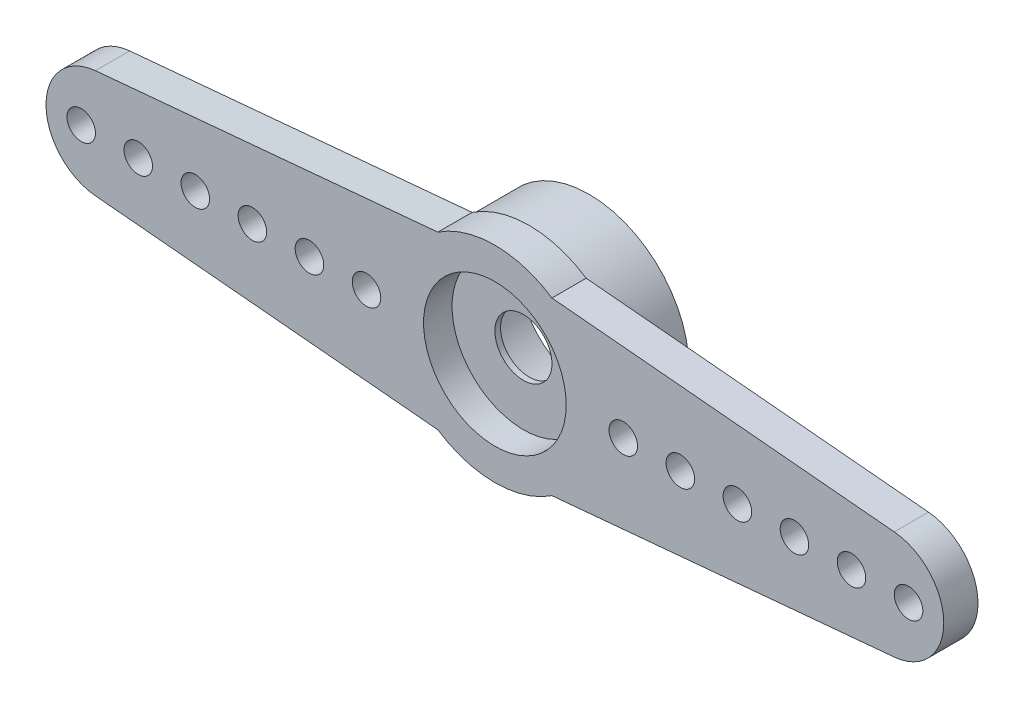
ISO-10303-21;
HEADER;
FILE_DESCRIPTION(('STEP AP214'),'2;1');
FILE_NAME('part.step','',(''),(''),'','','');
FILE_SCHEMA(('AUTOMOTIVE_DESIGN { 1 0 10303 214 1 1 1 1 }'));
ENDSEC;
DATA;
#1=APPLICATION_CONTEXT('core data for automotive mechanical design processes');
#2=APPLICATION_PROTOCOL_DEFINITION('international standard','automotive_design',2000,#1);
#3=PRODUCT_CONTEXT('',#1,'mechanical');
#4=PRODUCT('Part','Part','',(#3));
#5=PRODUCT_RELATED_PRODUCT_CATEGORY('part','',(#4));
#6=PRODUCT_DEFINITION_FORMATION('','',#4);
#7=PRODUCT_DEFINITION_CONTEXT('part definition',#1,'design');
#8=PRODUCT_DEFINITION('design','',#6,#7);
#9=PRODUCT_DEFINITION_SHAPE('','',#8);
#10=(LENGTH_UNIT() NAMED_UNIT(*) SI_UNIT(.MILLI.,.METRE.));
#11=(NAMED_UNIT(*) PLANE_ANGLE_UNIT() SI_UNIT($,.RADIAN.));
#12=(NAMED_UNIT(*) SI_UNIT($,.STERADIAN.) SOLID_ANGLE_UNIT());
#13=UNCERTAINTY_MEASURE_WITH_UNIT(LENGTH_MEASURE(1.E-05),#10,'distance_accuracy_value','');
#14=(GEOMETRIC_REPRESENTATION_CONTEXT(3) GLOBAL_UNCERTAINTY_ASSIGNED_CONTEXT((#13)) GLOBAL_UNIT_ASSIGNED_CONTEXT((#10,
#11,#12)) REPRESENTATION_CONTEXT('',''));
#15=CARTESIAN_POINT('',(0.,0.,0.));
#16=DIRECTION('',(0.,0.,1.));
#17=DIRECTION('',(1.,0.,0.));
#18=AXIS2_PLACEMENT_3D('',#15,#16,#17);
#19=CARTESIAN_POINT('',(0.,0.,-2.1));
#20=DIRECTION('',(0.,0.,1.));
#21=DIRECTION('',(1.,0.,0.));
#22=AXIS2_PLACEMENT_3D('',#19,#20,#21);
#23=CYLINDRICAL_SURFACE('',#22,1.);
#24=CARTESIAN_POINT('',(0.,0.,0.2));
#25=DIRECTION('',(0.,0.,1.));
#26=DIRECTION('',(1.,0.,0.));
#27=AXIS2_PLACEMENT_3D('',#24,#25,#26);
#28=CIRCLE('',#27,1.);
#29=CARTESIAN_POINT('',(1.,0.,0.2));
#30=VERTEX_POINT('',#29);
#31=EDGE_CURVE('E166',#30,#30,#28,.T.);
#32=ORIENTED_EDGE('',*,*,#31,.T.);
#33=EDGE_LOOP('',(#32));
#34=FACE_BOUND('',#33,.T.);
#35=CARTESIAN_POINT('',(0.,0.,0.));
#36=DIRECTION('',(0.,0.,-1.));
#37=DIRECTION('',(-1.,0.,0.));
#38=AXIS2_PLACEMENT_3D('',#35,#36,#37);
#39=CIRCLE('',#38,1.);
#40=CARTESIAN_POINT('',(-1.,0.,0.));
#41=VERTEX_POINT('',#40);
#42=EDGE_CURVE('E163',#41,#41,#39,.F.);
#43=ORIENTED_EDGE('',*,*,#42,.F.);
#44=EDGE_LOOP('',(#43));
#45=FACE_BOUND('',#44,.T.);
#46=ADVANCED_FACE('F37',(#34,#45),#23,.F.);
#47=CARTESIAN_POINT('',(-14.,1.9,1.2));
#48=DIRECTION('',(0.0912839495849539,-0.995824904563132,0.));
#49=DIRECTION('',(0.995824904563132,0.0912839495849539,0.));
#50=AXIS2_PLACEMENT_3D('',#47,#48,#49);
#51=PLANE('',#50);
#52=DIRECTION('',(-0.995824904563132,-0.0912839495849539,0.));
#53=VECTOR('',#52,1.);
#54=CARTESIAN_POINT('',(-14.,1.9,0.));
#55=LINE('',#54,#53);
#56=CARTESIAN_POINT('',(-2.,3.,0.));
#57=VERTEX_POINT('',#56);
#58=CARTESIAN_POINT('',(-14.,1.9,0.));
#59=VERTEX_POINT('',#58);
#60=EDGE_CURVE('E122',#57,#59,#55,.T.);
#61=ORIENTED_EDGE('',*,*,#60,.T.);
#62=DIRECTION('',(0.,0.,-1.));
#63=VECTOR('',#62,1.);
#64=CARTESIAN_POINT('',(-14.,1.9,1.2));
#65=LINE('',#64,#63);
#66=CARTESIAN_POINT('',(-14.,1.9,1.2));
#67=VERTEX_POINT('',#66);
#68=EDGE_CURVE('E124',#67,#59,#65,.T.);
#69=ORIENTED_EDGE('',*,*,#68,.F.);
#70=DIRECTION('',(-0.995824904563132,-0.0912839495849539,0.));
#71=VECTOR('',#70,1.);
#72=CARTESIAN_POINT('',(-14.,1.9,1.2));
#73=LINE('',#72,#71);
#74=CARTESIAN_POINT('',(-2.,3.,1.2));
#75=VERTEX_POINT('',#74);
#76=EDGE_CURVE('E94',#75,#67,#73,.T.);
#77=ORIENTED_EDGE('',*,*,#76,.F.);
#78=DIRECTION('',(0.,0.,-1.));
#79=VECTOR('',#78,1.);
#80=CARTESIAN_POINT('',(-2.,3.,1.2));
#81=LINE('',#80,#79);
#82=EDGE_CURVE('E47',#75,#57,#81,.T.);
#83=ORIENTED_EDGE('',*,*,#82,.T.);
#84=EDGE_LOOP('',(#61,#69,#77,#83));
#85=FACE_BOUND('',#84,.T.);
#86=ADVANCED_FACE('F39',(#85),#51,.F.);
#87=CARTESIAN_POINT('',(-13.8258333333333,0.,1.2));
#88=DIRECTION('',(0.,0.,-1.));
#89=DIRECTION('',(-1.,0.,0.));
#90=AXIS2_PLACEMENT_3D('',#87,#88,#89);
#91=CYLINDRICAL_SURFACE('',#90,1.90796593988933);
#92=CARTESIAN_POINT('',(-13.8258333333333,0.,0.));
#93=DIRECTION('',(0.,0.,1.));
#94=DIRECTION('',(1.,0.,0.));
#95=AXIS2_PLACEMENT_3D('',#92,#93,#94);
#96=CIRCLE('',#95,1.90796593988933);
#97=CARTESIAN_POINT('',(-14.,-1.9,0.));
#98=VERTEX_POINT('',#97);
#99=EDGE_CURVE('E130',#59,#98,#96,.T.);
#100=ORIENTED_EDGE('',*,*,#99,.T.);
#101=DIRECTION('',(0.,0.,-1.));
#102=VECTOR('',#101,1.);
#103=CARTESIAN_POINT('',(-14.,-1.9,1.2));
#104=LINE('',#103,#102);
#105=CARTESIAN_POINT('',(-14.,-1.9,1.2));
#106=VERTEX_POINT('',#105);
#107=EDGE_CURVE('E159',#106,#98,#104,.T.);
#108=ORIENTED_EDGE('',*,*,#107,.F.);
#109=CARTESIAN_POINT('',(-13.8258333333333,0.,1.2));
#110=DIRECTION('',(0.,0.,1.));
#111=DIRECTION('',(1.,0.,0.));
#112=AXIS2_PLACEMENT_3D('',#109,#110,#111);
#113=CIRCLE('',#112,1.90796593988933);
#114=EDGE_CURVE('E222',#67,#106,#113,.T.);
#115=ORIENTED_EDGE('',*,*,#114,.F.);
#116=ORIENTED_EDGE('',*,*,#68,.T.);
#117=EDGE_LOOP('',(#100,#108,#115,#116));
#118=FACE_BOUND('',#117,.T.);
#119=ADVANCED_FACE('F255',(#118),#91,.T.);
#120=CARTESIAN_POINT('',(-14.,-1.9,1.2));
#121=DIRECTION('',(0.0912839495849537,0.995824904563132,0.));
#122=DIRECTION('',(-0.995824904563133,0.0912839495849537,0.));
#123=AXIS2_PLACEMENT_3D('',#120,#121,#122);
#124=PLANE('',#123);
#125=DIRECTION('',(0.995824904563132,-0.0912839495849537,0.));
#126=VECTOR('',#125,1.);
#127=CARTESIAN_POINT('',(-14.,-1.9,0.));
#128=LINE('',#127,#126);
#129=CARTESIAN_POINT('',(-2.,-3.,0.));
#130=VERTEX_POINT('',#129);
#131=EDGE_CURVE('E133',#98,#130,#128,.T.);
#132=ORIENTED_EDGE('',*,*,#131,.T.);
#133=DIRECTION('',(0.,0.,-1.));
#134=VECTOR('',#133,1.);
#135=CARTESIAN_POINT('',(-2.,-3.,1.2));
#136=LINE('',#135,#134);
#137=CARTESIAN_POINT('',(-2.,-3.,1.2));
#138=VERTEX_POINT('',#137);
#139=EDGE_CURVE('E157',#138,#130,#136,.T.);
#140=ORIENTED_EDGE('',*,*,#139,.F.);
#141=DIRECTION('',(0.995824904563132,-0.0912839495849537,0.));
#142=VECTOR('',#141,1.);
#143=CARTESIAN_POINT('',(-14.,-1.9,1.2));
#144=LINE('',#143,#142);
#145=EDGE_CURVE('E224',#106,#138,#144,.T.);
#146=ORIENTED_EDGE('',*,*,#145,.F.);
#147=ORIENTED_EDGE('',*,*,#107,.T.);
#148=EDGE_LOOP('',(#132,#140,#146,#147));
#149=FACE_BOUND('',#148,.T.);
#150=ADVANCED_FACE('F247',(#149),#124,.F.);
#151=CARTESIAN_POINT('',(14.,-1.9,1.2));
#152=DIRECTION('',(-0.0912839495849538,0.995824904563132,0.));
#153=DIRECTION('',(-0.995824904563132,-0.0912839495849538,0.));
#154=AXIS2_PLACEMENT_3D('',#151,#152,#153);
#155=PLANE('',#154);
#156=DIRECTION('',(0.995824904563132,0.0912839495849538,0.));
#157=VECTOR('',#156,1.);
#158=CARTESIAN_POINT('',(14.,-1.9,0.));
#159=LINE('',#158,#157);
#160=CARTESIAN_POINT('',(2.,-3.,0.));
#161=VERTEX_POINT('',#160);
#162=CARTESIAN_POINT('',(14.,-1.9,0.));
#163=VERTEX_POINT('',#162);
#164=EDGE_CURVE('E144',#161,#163,#159,.T.);
#165=ORIENTED_EDGE('',*,*,#164,.T.);
#166=DIRECTION('',(0.,0.,-1.));
#167=VECTOR('',#166,1.);
#168=CARTESIAN_POINT('',(14.,-1.9,1.2));
#169=LINE('',#168,#167);
#170=CARTESIAN_POINT('',(14.,-1.9,1.2));
#171=VERTEX_POINT('',#170);
#172=EDGE_CURVE('E152',#171,#163,#169,.T.);
#173=ORIENTED_EDGE('',*,*,#172,.F.);
#174=DIRECTION('',(0.995824904563132,0.0912839495849538,0.));
#175=VECTOR('',#174,1.);
#176=CARTESIAN_POINT('',(14.,-1.9,1.2));
#177=LINE('',#176,#175);
#178=CARTESIAN_POINT('',(2.,-3.,1.2));
#179=VERTEX_POINT('',#178);
#180=EDGE_CURVE('E227',#179,#171,#177,.T.);
#181=ORIENTED_EDGE('',*,*,#180,.F.);
#182=DIRECTION('',(0.,0.,-1.));
#183=VECTOR('',#182,1.);
#184=CARTESIAN_POINT('',(2.,-3.,1.2));
#185=LINE('',#184,#183);
#186=EDGE_CURVE('E154',#179,#161,#185,.T.);
#187=ORIENTED_EDGE('',*,*,#186,.T.);
#188=EDGE_LOOP('',(#165,#173,#181,#187));
#189=FACE_BOUND('',#188,.T.);
#190=ADVANCED_FACE('F237',(#189),#155,.F.);
#191=CARTESIAN_POINT('',(13.8258333333333,0.,1.2));
#192=DIRECTION('',(0.,0.,-1.));
#193=DIRECTION('',(-1.,0.,0.));
#194=AXIS2_PLACEMENT_3D('',#191,#192,#193);
#195=CYLINDRICAL_SURFACE('',#194,1.90796593988933);
#196=CARTESIAN_POINT('',(13.8258333333333,0.,0.));
#197=DIRECTION('',(0.,0.,1.));
#198=DIRECTION('',(1.,0.,0.));
#199=AXIS2_PLACEMENT_3D('',#196,#197,#198);
#200=CIRCLE('',#199,1.90796593988933);
#201=CARTESIAN_POINT('',(14.,1.9,0.));
#202=VERTEX_POINT('',#201);
#203=EDGE_CURVE('E79',#163,#202,#200,.T.);
#204=ORIENTED_EDGE('',*,*,#203,.T.);
#205=DIRECTION('',(0.,0.,-1.));
#206=VECTOR('',#205,1.);
#207=CARTESIAN_POINT('',(14.,1.9,1.2));
#208=LINE('',#207,#206);
#209=CARTESIAN_POINT('',(14.,1.9,1.2));
#210=VERTEX_POINT('',#209);
#211=EDGE_CURVE('E150',#210,#202,#208,.T.);
#212=ORIENTED_EDGE('',*,*,#211,.F.);
#213=CARTESIAN_POINT('',(13.8258333333333,0.,1.2));
#214=DIRECTION('',(0.,0.,1.));
#215=DIRECTION('',(1.,0.,0.));
#216=AXIS2_PLACEMENT_3D('',#213,#214,#215);
#217=CIRCLE('',#216,1.90796593988933);
#218=EDGE_CURVE('E56',#171,#210,#217,.T.);
#219=ORIENTED_EDGE('',*,*,#218,.F.);
#220=ORIENTED_EDGE('',*,*,#172,.T.);
#221=EDGE_LOOP('',(#204,#212,#219,#220));
#222=FACE_BOUND('',#221,.T.);
#223=ADVANCED_FACE('F239',(#222),#195,.T.);
#224=CARTESIAN_POINT('',(2.,3.,1.2));
#225=DIRECTION('',(-0.0912839495849538,-0.995824904563132,0.));
#226=DIRECTION('',(0.995824904563132,-0.0912839495849538,0.));
#227=AXIS2_PLACEMENT_3D('',#224,#225,#226);
#228=PLANE('',#227);
#229=DIRECTION('',(-0.995824904563132,0.0912839495849538,0.));
#230=VECTOR('',#229,1.);
#231=CARTESIAN_POINT('',(2.,3.,0.));
#232=LINE('',#231,#230);
#233=CARTESIAN_POINT('',(2.,3.,0.));
#234=VERTEX_POINT('',#233);
#235=EDGE_CURVE('E147',#202,#234,#232,.T.);
#236=ORIENTED_EDGE('',*,*,#235,.T.);
#237=DIRECTION('',(0.,0.,-1.));
#238=VECTOR('',#237,1.);
#239=CARTESIAN_POINT('',(2.,3.,1.2));
#240=LINE('',#239,#238);
#241=CARTESIAN_POINT('',(2.,3.,1.2));
#242=VERTEX_POINT('',#241);
#243=EDGE_CURVE('E87',#242,#234,#240,.T.);
#244=ORIENTED_EDGE('',*,*,#243,.F.);
#245=DIRECTION('',(-0.995824904563132,0.0912839495849538,0.));
#246=VECTOR('',#245,1.);
#247=CARTESIAN_POINT('',(2.,3.,1.2));
#248=LINE('',#247,#246);
#249=EDGE_CURVE('E139',#210,#242,#248,.T.);
#250=ORIENTED_EDGE('',*,*,#249,.F.);
#251=ORIENTED_EDGE('',*,*,#211,.T.);
#252=EDGE_LOOP('',(#236,#244,#250,#251));
#253=FACE_BOUND('',#252,.T.);
#254=ADVANCED_FACE('F232',(#253),#228,.F.);
#255=CARTESIAN_POINT('',(0.,6.75,1.2));
#256=DIRECTION('',(0.,0.,-1.));
#257=DIRECTION('',(-1.,0.,0.));
#258=AXIS2_PLACEMENT_3D('',#255,#256,#257);
#259=PLANE('',#258);
#260=CARTESIAN_POINT('',(14.5,0.,1.2));
#261=DIRECTION('',(0.,0.,1.));
#262=DIRECTION('',(-1.,0.,0.));
#263=AXIS2_PLACEMENT_3D('',#260,#261,#262);
#264=CIRCLE('',#263,0.500000000000001);
#265=CARTESIAN_POINT('',(14.,0.,1.2));
#266=VERTEX_POINT('',#265);
#267=EDGE_CURVE('E518',#266,#266,#264,.T.);
#268=ORIENTED_EDGE('',*,*,#267,.F.);
#269=EDGE_LOOP('',(#268));
#270=FACE_BOUND('',#269,.T.);
#271=CARTESIAN_POINT('',(12.5,0.,1.2));
#272=DIRECTION('',(0.,0.,1.));
#273=DIRECTION('',(-1.,0.,0.));
#274=AXIS2_PLACEMENT_3D('',#271,#272,#273);
#275=CIRCLE('',#274,0.500000000000001);
#276=CARTESIAN_POINT('',(12.,0.,1.2));
#277=VERTEX_POINT('',#276);
#278=EDGE_CURVE('E549',#277,#277,#275,.T.);
#279=ORIENTED_EDGE('',*,*,#278,.F.);
#280=EDGE_LOOP('',(#279));
#281=FACE_BOUND('',#280,.T.);
#282=CARTESIAN_POINT('',(10.5,0.,1.2));
#283=DIRECTION('',(0.,0.,1.));
#284=DIRECTION('',(-1.,0.,0.));
#285=AXIS2_PLACEMENT_3D('',#282,#283,#284);
#286=CIRCLE('',#285,0.500000000000001);
#287=CARTESIAN_POINT('',(10.,0.,1.2));
#288=VERTEX_POINT('',#287);
#289=EDGE_CURVE('E535',#288,#288,#286,.T.);
#290=ORIENTED_EDGE('',*,*,#289,.F.);
#291=EDGE_LOOP('',(#290));
#292=FACE_BOUND('',#291,.T.);
#293=CARTESIAN_POINT('',(-6.5,0.,1.2));
#294=DIRECTION('',(0.,0.,1.));
#295=DIRECTION('',(1.,0.,0.));
#296=AXIS2_PLACEMENT_3D('',#293,#294,#295);
#297=CIRCLE('',#296,0.5);
#298=CARTESIAN_POINT('',(-6.,0.,1.2));
#299=VERTEX_POINT('',#298);
#300=EDGE_CURVE('E536',#299,#299,#297,.T.);
#301=ORIENTED_EDGE('',*,*,#300,.F.);
#302=EDGE_LOOP('',(#301));
#303=FACE_BOUND('',#302,.T.);
#304=CARTESIAN_POINT('',(-8.5,0.,1.2));
#305=DIRECTION('',(0.,0.,1.));
#306=DIRECTION('',(1.,0.,0.));
#307=AXIS2_PLACEMENT_3D('',#304,#305,#306);
#308=CIRCLE('',#307,0.500000000000001);
#309=CARTESIAN_POINT('',(-8.,0.,1.2));
#310=VERTEX_POINT('',#309);
#311=EDGE_CURVE('E539',#310,#310,#308,.T.);
#312=ORIENTED_EDGE('',*,*,#311,.F.);
#313=EDGE_LOOP('',(#312));
#314=FACE_BOUND('',#313,.T.);
#315=CARTESIAN_POINT('',(-10.5,0.,1.2));
#316=DIRECTION('',(0.,0.,1.));
#317=DIRECTION('',(1.,0.,0.));
#318=AXIS2_PLACEMENT_3D('',#315,#316,#317);
#319=CIRCLE('',#318,0.500000000000001);
#320=CARTESIAN_POINT('',(-10.,0.,1.2));
#321=VERTEX_POINT('',#320);
#322=EDGE_CURVE('E542',#321,#321,#319,.T.);
#323=ORIENTED_EDGE('',*,*,#322,.F.);
#324=EDGE_LOOP('',(#323));
#325=FACE_BOUND('',#324,.T.);
#326=CARTESIAN_POINT('',(-12.5,0.,1.2));
#327=DIRECTION('',(0.,0.,1.));
#328=DIRECTION('',(1.,0.,0.));
#329=AXIS2_PLACEMENT_3D('',#326,#327,#328);
#330=CIRCLE('',#329,0.500000000000001);
#331=CARTESIAN_POINT('',(-12.,0.,1.2));
#332=VERTEX_POINT('',#331);
#333=EDGE_CURVE('E525',#332,#332,#330,.T.);
#334=ORIENTED_EDGE('',*,*,#333,.F.);
#335=EDGE_LOOP('',(#334));
#336=FACE_BOUND('',#335,.T.);
#337=CARTESIAN_POINT('',(-14.5,0.,1.2));
#338=DIRECTION('',(0.,0.,1.));
#339=DIRECTION('',(1.,0.,0.));
#340=AXIS2_PLACEMENT_3D('',#337,#338,#339);
#341=CIRCLE('',#340,0.500000000000001);
#342=CARTESIAN_POINT('',(-14.,0.,1.2));
#343=VERTEX_POINT('',#342);
#344=EDGE_CURVE('E522',#343,#343,#341,.T.);
#345=ORIENTED_EDGE('',*,*,#344,.F.);
#346=EDGE_LOOP('',(#345));
#347=FACE_BOUND('',#346,.T.);
#348=CARTESIAN_POINT('',(4.5,0.,1.2));
#349=DIRECTION('',(0.,0.,1.));
#350=DIRECTION('',(-1.,0.,0.));
#351=AXIS2_PLACEMENT_3D('',#348,#349,#350);
#352=CIRCLE('',#351,0.5);
#353=CARTESIAN_POINT('',(4.,0.,1.2));
#354=VERTEX_POINT('',#353);
#355=EDGE_CURVE('E526',#354,#354,#352,.T.);
#356=ORIENTED_EDGE('',*,*,#355,.F.);
#357=EDGE_LOOP('',(#356));
#358=FACE_BOUND('',#357,.T.);
#359=CARTESIAN_POINT('',(6.5,0.,1.2));
#360=DIRECTION('',(0.,0.,1.));
#361=DIRECTION('',(-1.,0.,0.));
#362=AXIS2_PLACEMENT_3D('',#359,#360,#361);
#363=CIRCLE('',#362,0.5);
#364=CARTESIAN_POINT('',(6.,0.,1.2));
#365=VERTEX_POINT('',#364);
#366=EDGE_CURVE('E529',#365,#365,#363,.T.);
#367=ORIENTED_EDGE('',*,*,#366,.F.);
#368=EDGE_LOOP('',(#367));
#369=FACE_BOUND('',#368,.T.);
#370=CARTESIAN_POINT('',(8.5,0.,1.2));
#371=DIRECTION('',(0.,0.,1.));
#372=DIRECTION('',(-1.,0.,0.));
#373=AXIS2_PLACEMENT_3D('',#370,#371,#372);
#374=CIRCLE('',#373,0.500000000000001);
#375=CARTESIAN_POINT('',(8.,0.,1.2));
#376=VERTEX_POINT('',#375);
#377=EDGE_CURVE('E532',#376,#376,#374,.T.);
#378=ORIENTED_EDGE('',*,*,#377,.F.);
#379=EDGE_LOOP('',(#378));
#380=FACE_BOUND('',#379,.T.);
#381=CARTESIAN_POINT('',(-4.5,0.,1.2));
#382=DIRECTION('',(0.,0.,1.));
#383=DIRECTION('',(1.,0.,0.));
#384=AXIS2_PLACEMENT_3D('',#381,#382,#383);
#385=CIRCLE('',#384,0.5);
#386=CARTESIAN_POINT('',(-4.,0.,1.2));
#387=VERTEX_POINT('',#386);
#388=EDGE_CURVE('E172',#387,#387,#385,.T.);
#389=ORIENTED_EDGE('',*,*,#388,.F.);
#390=EDGE_LOOP('',(#389));
#391=FACE_BOUND('',#390,.T.);
#392=CARTESIAN_POINT('',(0.,0.,1.2));
#393=DIRECTION('',(0.,0.,1.));
#394=DIRECTION('',(1.,0.,0.));
#395=AXIS2_PLACEMENT_3D('',#392,#393,#394);
#396=CIRCLE('',#395,2.5);
#397=CARTESIAN_POINT('',(2.5,0.,1.2));
#398=VERTEX_POINT('',#397);
#399=EDGE_CURVE('E216',#398,#398,#396,.T.);
#400=ORIENTED_EDGE('',*,*,#399,.F.);
#401=EDGE_LOOP('',(#400));
#402=FACE_BOUND('',#401,.T.);
#403=ORIENTED_EDGE('',*,*,#249,.T.);
#404=CARTESIAN_POINT('',(0.,0.,1.2));
#405=DIRECTION('',(0.,0.,-1.));
#406=DIRECTION('',(-1.,0.,0.));
#407=AXIS2_PLACEMENT_3D('',#404,#405,#406);
#408=CIRCLE('',#407,3.60555127546399);
#409=EDGE_CURVE('E230',#242,#75,#408,.F.);
#410=ORIENTED_EDGE('',*,*,#409,.T.);
#411=ORIENTED_EDGE('',*,*,#76,.T.);
#412=ORIENTED_EDGE('',*,*,#114,.T.);
#413=ORIENTED_EDGE('',*,*,#145,.T.);
#414=CARTESIAN_POINT('',(0.,0.,1.2));
#415=DIRECTION('',(0.,0.,-1.));
#416=DIRECTION('',(-1.,0.,0.));
#417=AXIS2_PLACEMENT_3D('',#414,#415,#416);
#418=CIRCLE('',#417,3.60555127546399);
#419=EDGE_CURVE('E118',#138,#179,#418,.F.);
#420=ORIENTED_EDGE('',*,*,#419,.T.);
#421=ORIENTED_EDGE('',*,*,#180,.T.);
#422=ORIENTED_EDGE('',*,*,#218,.T.);
#423=EDGE_LOOP('',(#403,#410,#411,#412,#413,#420,#421,#422));
#424=FACE_BOUND('',#423,.T.);
#425=ADVANCED_FACE('F229',(#270,#281,#292,#303,#314,#325,#336,#347,#358,#369,#380,#391,#402,
#424),#259,.F.);
#426=CARTESIAN_POINT('',(0.,6.75,0.));
#427=DIRECTION('',(0.,0.,-1.));
#428=DIRECTION('',(-1.,0.,0.));
#429=AXIS2_PLACEMENT_3D('',#426,#427,#428);
#430=PLANE('',#429);
#431=CARTESIAN_POINT('',(0.,0.,0.));
#432=DIRECTION('',(0.,0.,1.));
#433=DIRECTION('',(1.,0.,0.));
#434=AXIS2_PLACEMENT_3D('',#431,#432,#433);
#435=CIRCLE('',#434,3.60555127546399);
#436=EDGE_CURVE('E111',#234,#57,#435,.T.);
#437=ORIENTED_EDGE('',*,*,#436,.F.);
#438=ORIENTED_EDGE('',*,*,#235,.F.);
#439=ORIENTED_EDGE('',*,*,#203,.F.);
#440=ORIENTED_EDGE('',*,*,#164,.F.);
#441=CARTESIAN_POINT('',(0.,0.,0.));
#442=DIRECTION('',(0.,0.,1.));
#443=DIRECTION('',(-1.,0.,0.));
#444=AXIS2_PLACEMENT_3D('',#441,#442,#443);
#445=CIRCLE('',#444,3.60555127546399);
#446=EDGE_CURVE('E119',#130,#161,#445,.T.);
#447=ORIENTED_EDGE('',*,*,#446,.F.);
#448=ORIENTED_EDGE('',*,*,#131,.F.);
#449=ORIENTED_EDGE('',*,*,#99,.F.);
#450=ORIENTED_EDGE('',*,*,#60,.F.);
#451=EDGE_LOOP('',(#437,#438,#439,#440,#447,#448,#449,#450));
#452=FACE_BOUND('',#451,.T.);
#453=CARTESIAN_POINT('',(14.5,0.,0.));
#454=DIRECTION('',(0.,0.,-1.));
#455=DIRECTION('',(-1.,0.,0.));
#456=AXIS2_PLACEMENT_3D('',#453,#454,#455);
#457=CIRCLE('',#456,0.500000000000001);
#458=CARTESIAN_POINT('',(14.,0.,0.));
#459=VERTEX_POINT('',#458);
#460=EDGE_CURVE('E41',#459,#459,#457,.T.);
#461=ORIENTED_EDGE('',*,*,#460,.F.);
#462=EDGE_LOOP('',(#461));
#463=FACE_BOUND('',#462,.T.);
#464=CARTESIAN_POINT('',(12.5,0.,0.));
#465=DIRECTION('',(0.,0.,-1.));
#466=DIRECTION('',(-1.,0.,0.));
#467=AXIS2_PLACEMENT_3D('',#464,#465,#466);
#468=CIRCLE('',#467,0.500000000000001);
#469=CARTESIAN_POINT('',(12.,0.,0.));
#470=VERTEX_POINT('',#469);
#471=EDGE_CURVE('E198',#470,#470,#468,.T.);
#472=ORIENTED_EDGE('',*,*,#471,.F.);
#473=EDGE_LOOP('',(#472));
#474=FACE_BOUND('',#473,.T.);
#475=CARTESIAN_POINT('',(10.5,0.,0.));
#476=DIRECTION('',(0.,0.,-1.));
#477=DIRECTION('',(-1.,0.,0.));
#478=AXIS2_PLACEMENT_3D('',#475,#476,#477);
#479=CIRCLE('',#478,0.500000000000001);
#480=CARTESIAN_POINT('',(10.,0.,0.));
#481=VERTEX_POINT('',#480);
#482=EDGE_CURVE('E196',#481,#481,#479,.T.);
#483=ORIENTED_EDGE('',*,*,#482,.F.);
#484=EDGE_LOOP('',(#483));
#485=FACE_BOUND('',#484,.T.);
#486=CARTESIAN_POINT('',(-6.5,0.,0.));
#487=DIRECTION('',(0.,0.,-1.));
#488=DIRECTION('',(-1.,0.,0.));
#489=AXIS2_PLACEMENT_3D('',#486,#487,#488);
#490=CIRCLE('',#489,0.5);
#491=CARTESIAN_POINT('',(-7.,0.,0.));
#492=VERTEX_POINT('',#491);
#493=EDGE_CURVE('E193',#492,#492,#490,.T.);
#494=ORIENTED_EDGE('',*,*,#493,.F.);
#495=EDGE_LOOP('',(#494));
#496=FACE_BOUND('',#495,.T.);
#497=CARTESIAN_POINT('',(-8.5,0.,0.));
#498=DIRECTION('',(0.,0.,-1.));
#499=DIRECTION('',(-1.,0.,0.));
#500=AXIS2_PLACEMENT_3D('',#497,#498,#499);
#501=CIRCLE('',#500,0.500000000000001);
#502=CARTESIAN_POINT('',(-9.,0.,0.));
#503=VERTEX_POINT('',#502);
#504=EDGE_CURVE('E190',#503,#503,#501,.T.);
#505=ORIENTED_EDGE('',*,*,#504,.F.);
#506=EDGE_LOOP('',(#505));
#507=FACE_BOUND('',#506,.T.);
#508=CARTESIAN_POINT('',(-10.5,0.,0.));
#509=DIRECTION('',(0.,0.,-1.));
#510=DIRECTION('',(-1.,0.,0.));
#511=AXIS2_PLACEMENT_3D('',#508,#509,#510);
#512=CIRCLE('',#511,0.500000000000001);
#513=CARTESIAN_POINT('',(-11.,0.,0.));
#514=VERTEX_POINT('',#513);
#515=EDGE_CURVE('E187',#514,#514,#512,.T.);
#516=ORIENTED_EDGE('',*,*,#515,.F.);
#517=EDGE_LOOP('',(#516));
#518=FACE_BOUND('',#517,.T.);
#519=CARTESIAN_POINT('',(-12.5,0.,0.));
#520=DIRECTION('',(0.,0.,-1.));
#521=DIRECTION('',(-1.,0.,0.));
#522=AXIS2_PLACEMENT_3D('',#519,#520,#521);
#523=CIRCLE('',#522,0.500000000000001);
#524=CARTESIAN_POINT('',(-13.,0.,0.));
#525=VERTEX_POINT('',#524);
#526=EDGE_CURVE('E184',#525,#525,#523,.T.);
#527=ORIENTED_EDGE('',*,*,#526,.F.);
#528=EDGE_LOOP('',(#527));
#529=FACE_BOUND('',#528,.T.);
#530=CARTESIAN_POINT('',(-14.5,0.,0.));
#531=DIRECTION('',(0.,0.,-1.));
#532=DIRECTION('',(-1.,0.,0.));
#533=AXIS2_PLACEMENT_3D('',#530,#531,#532);
#534=CIRCLE('',#533,0.500000000000001);
#535=CARTESIAN_POINT('',(-15.,0.,0.));
#536=VERTEX_POINT('',#535);
#537=EDGE_CURVE('E181',#536,#536,#534,.T.);
#538=ORIENTED_EDGE('',*,*,#537,.F.);
#539=EDGE_LOOP('',(#538));
#540=FACE_BOUND('',#539,.T.);
#541=CARTESIAN_POINT('',(4.5,0.,0.));
#542=DIRECTION('',(0.,0.,-1.));
#543=DIRECTION('',(-1.,0.,0.));
#544=AXIS2_PLACEMENT_3D('',#541,#542,#543);
#545=CIRCLE('',#544,0.5);
#546=CARTESIAN_POINT('',(4.,0.,0.));
#547=VERTEX_POINT('',#546);
#548=EDGE_CURVE('E178',#547,#547,#545,.T.);
#549=ORIENTED_EDGE('',*,*,#548,.F.);
#550=EDGE_LOOP('',(#549));
#551=FACE_BOUND('',#550,.T.);
#552=CARTESIAN_POINT('',(6.5,0.,0.));
#553=DIRECTION('',(0.,0.,-1.));
#554=DIRECTION('',(-1.,0.,0.));
#555=AXIS2_PLACEMENT_3D('',#552,#553,#554);
#556=CIRCLE('',#555,0.5);
#557=CARTESIAN_POINT('',(6.,0.,0.));
#558=VERTEX_POINT('',#557);
#559=EDGE_CURVE('E175',#558,#558,#556,.T.);
#560=ORIENTED_EDGE('',*,*,#559,.F.);
#561=EDGE_LOOP('',(#560));
#562=FACE_BOUND('',#561,.T.);
#563=CARTESIAN_POINT('',(8.5,0.,0.));
#564=DIRECTION('',(0.,0.,-1.));
#565=DIRECTION('',(-1.,0.,0.));
#566=AXIS2_PLACEMENT_3D('',#563,#564,#565);
#567=CIRCLE('',#566,0.500000000000001);
#568=CARTESIAN_POINT('',(8.,0.,0.));
#569=VERTEX_POINT('',#568);
#570=EDGE_CURVE('E171',#569,#569,#567,.T.);
#571=ORIENTED_EDGE('',*,*,#570,.F.);
#572=EDGE_LOOP('',(#571));
#573=FACE_BOUND('',#572,.T.);
#574=CARTESIAN_POINT('',(-4.5,0.,0.));
#575=DIRECTION('',(0.,0.,-1.));
#576=DIRECTION('',(-1.,0.,0.));
#577=AXIS2_PLACEMENT_3D('',#574,#575,#576);
#578=CIRCLE('',#577,0.5);
#579=CARTESIAN_POINT('',(-5.,0.,0.));
#580=VERTEX_POINT('',#579);
#581=EDGE_CURVE('E168',#580,#580,#578,.T.);
#582=ORIENTED_EDGE('',*,*,#581,.F.);
#583=EDGE_LOOP('',(#582));
#584=FACE_BOUND('',#583,.T.);
#585=CARTESIAN_POINT('',(0.,0.,0.));
#586=DIRECTION('',(0.,0.,-1.));
#587=DIRECTION('',(-1.,0.,0.));
#588=AXIS2_PLACEMENT_3D('',#585,#586,#587);
#589=CIRCLE('',#588,3.5);
#590=CARTESIAN_POINT('',(-3.5,0.,0.));
#591=VERTEX_POINT('',#590);
#592=EDGE_CURVE('E11',#591,#591,#589,.T.);
#593=ORIENTED_EDGE('',*,*,#592,.F.);
#594=EDGE_LOOP('',(#593));
#595=FACE_BOUND('',#594,.T.);
#596=ADVANCED_FACE('F127',(#452,#463,#474,#485,#496,#507,#518,#529,#540,#551,#562,#573,#584,
#595),#430,.T.);
#597=CARTESIAN_POINT('',(0.,0.,-2.1));
#598=DIRECTION('',(0.,0.,1.));
#599=DIRECTION('',(1.,0.,0.));
#600=AXIS2_PLACEMENT_3D('',#597,#598,#599);
#601=CYLINDRICAL_SURFACE('',#600,3.5);
#602=CARTESIAN_POINT('',(0.,0.,-2.1));
#603=DIRECTION('',(0.,0.,-1.));
#604=DIRECTION('',(-1.,0.,0.));
#605=AXIS2_PLACEMENT_3D('',#602,#603,#604);
#606=CIRCLE('',#605,3.5);
#607=CARTESIAN_POINT('',(-3.5,0.,-2.1));
#608=VERTEX_POINT('',#607);
#609=EDGE_CURVE('E131',#608,#608,#606,.T.);
#610=ORIENTED_EDGE('',*,*,#609,.F.);
#611=EDGE_LOOP('',(#610));
#612=FACE_BOUND('',#611,.T.);
#613=ORIENTED_EDGE('',*,*,#592,.T.);
#614=EDGE_LOOP('',(#613));
#615=FACE_BOUND('',#614,.T.);
#616=ADVANCED_FACE('F273',(#612,#615),#601,.T.);
#617=CARTESIAN_POINT('',(0.,0.,-2.1));
#618=DIRECTION('',(0.,0.,-1.));
#619=DIRECTION('',(-1.,0.,0.));
#620=AXIS2_PLACEMENT_3D('',#617,#618,#619);
#621=PLANE('',#620);
#622=CARTESIAN_POINT('',(0.,0.,-2.1));
#623=DIRECTION('',(0.,0.,-1.));
#624=DIRECTION('',(-1.,0.,0.));
#625=AXIS2_PLACEMENT_3D('',#622,#623,#624);
#626=CIRCLE('',#625,2.45);
#627=CARTESIAN_POINT('',(-2.45,0.,-2.1));
#628=VERTEX_POINT('',#627);
#629=EDGE_CURVE('E203',#628,#628,#626,.T.);
#630=ORIENTED_EDGE('',*,*,#629,.F.);
#631=EDGE_LOOP('',(#630));
#632=FACE_BOUND('',#631,.T.);
#633=ORIENTED_EDGE('',*,*,#609,.T.);
#634=EDGE_LOOP('',(#633));
#635=FACE_BOUND('',#634,.T.);
#636=ADVANCED_FACE('F269',(#632,#635),#621,.T.);
#637=CARTESIAN_POINT('',(0.,0.,0.2));
#638=DIRECTION('',(0.,0.,1.));
#639=DIRECTION('',(1.,0.,0.));
#640=AXIS2_PLACEMENT_3D('',#637,#638,#639);
#641=CYLINDRICAL_SURFACE('',#640,2.5);
#642=CARTESIAN_POINT('',(0.,0.,0.2));
#643=DIRECTION('',(0.,0.,1.));
#644=DIRECTION('',(1.,0.,0.));
#645=AXIS2_PLACEMENT_3D('',#642,#643,#644);
#646=CIRCLE('',#645,2.5);
#647=CARTESIAN_POINT('',(2.5,0.,0.2));
#648=VERTEX_POINT('',#647);
#649=EDGE_CURVE('E136',#648,#648,#646,.T.);
#650=ORIENTED_EDGE('',*,*,#649,.F.);
#651=EDGE_LOOP('',(#650));
#652=FACE_BOUND('',#651,.T.);
#653=ORIENTED_EDGE('',*,*,#399,.T.);
#654=EDGE_LOOP('',(#653));
#655=FACE_BOUND('',#654,.T.);
#656=ADVANCED_FACE('F265',(#652,#655),#641,.F.);
#657=CARTESIAN_POINT('',(0.,0.,0.2));
#658=DIRECTION('',(0.,0.,1.));
#659=DIRECTION('',(1.,0.,0.));
#660=AXIS2_PLACEMENT_3D('',#657,#658,#659);
#661=PLANE('',#660);
#662=ORIENTED_EDGE('',*,*,#31,.F.);
#663=EDGE_LOOP('',(#662));
#664=FACE_BOUND('',#663,.T.);
#665=ORIENTED_EDGE('',*,*,#649,.T.);
#666=EDGE_LOOP('',(#665));
#667=FACE_BOUND('',#666,.T.);
#668=ADVANCED_FACE('F261',(#664,#667),#661,.T.);
#669=CARTESIAN_POINT('',(0.,0.,0.));
#670=DIRECTION('',(0.,0.,-1.));
#671=DIRECTION('',(-1.,0.,0.));
#672=AXIS2_PLACEMENT_3D('',#669,#670,#671);
#673=PLANE('',#672);
#674=CARTESIAN_POINT('',(0.,0.,0.));
#675=DIRECTION('',(0.,0.,-1.));
#676=DIRECTION('',(-1.,0.,0.));
#677=AXIS2_PLACEMENT_3D('',#674,#675,#676);
#678=CIRCLE('',#677,2.45);
#679=CARTESIAN_POINT('',(-2.45,0.,0.));
#680=VERTEX_POINT('',#679);
#681=EDGE_CURVE('E167',#680,#680,#678,.T.);
#682=ORIENTED_EDGE('',*,*,#681,.T.);
#683=EDGE_LOOP('',(#682));
#684=FACE_BOUND('',#683,.T.);
#685=ORIENTED_EDGE('',*,*,#42,.T.);
#686=EDGE_LOOP('',(#685));
#687=FACE_BOUND('',#686,.T.);
#688=ADVANCED_FACE('F264',(#684,#687),#673,.T.);
#689=CARTESIAN_POINT('',(0.,0.,0.));
#690=DIRECTION('',(0.,0.,-1.));
#691=DIRECTION('',(-1.,0.,0.));
#692=AXIS2_PLACEMENT_3D('',#689,#690,#691);
#693=CYLINDRICAL_SURFACE('',#692,2.45);
#694=ORIENTED_EDGE('',*,*,#681,.F.);
#695=EDGE_LOOP('',(#694));
#696=FACE_BOUND('',#695,.T.);
#697=ORIENTED_EDGE('',*,*,#629,.T.);
#698=EDGE_LOOP('',(#697));
#699=FACE_BOUND('',#698,.T.);
#700=ADVANCED_FACE('F259',(#696,#699),#693,.F.);
#701=CARTESIAN_POINT('',(-4.5,0.,-2.1));
#702=DIRECTION('',(0.,0.,1.));
#703=DIRECTION('',(1.,0.,0.));
#704=AXIS2_PLACEMENT_3D('',#701,#702,#703);
#705=CYLINDRICAL_SURFACE('',#704,0.5);
#706=ORIENTED_EDGE('',*,*,#581,.T.);
#707=EDGE_LOOP('',(#706));
#708=FACE_BOUND('',#707,.T.);
#709=ORIENTED_EDGE('',*,*,#388,.T.);
#710=EDGE_LOOP('',(#709));
#711=FACE_BOUND('',#710,.T.);
#712=ADVANCED_FACE('F315',(#708,#711),#705,.F.);
#713=CARTESIAN_POINT('',(8.5,0.,-2.1));
#714=DIRECTION('',(0.,0.,1.));
#715=DIRECTION('',(1.,0.,0.));
#716=AXIS2_PLACEMENT_3D('',#713,#714,#715);
#717=CYLINDRICAL_SURFACE('',#716,0.500000000000001);
#718=ORIENTED_EDGE('',*,*,#570,.T.);
#719=EDGE_LOOP('',(#718));
#720=FACE_BOUND('',#719,.T.);
#721=ORIENTED_EDGE('',*,*,#377,.T.);
#722=EDGE_LOOP('',(#721));
#723=FACE_BOUND('',#722,.T.);
#724=ADVANCED_FACE('F322',(#720,#723),#717,.F.);
#725=CARTESIAN_POINT('',(6.5,0.,-2.1));
#726=DIRECTION('',(0.,0.,1.));
#727=DIRECTION('',(1.,0.,0.));
#728=AXIS2_PLACEMENT_3D('',#725,#726,#727);
#729=CYLINDRICAL_SURFACE('',#728,0.5);
#730=ORIENTED_EDGE('',*,*,#559,.T.);
#731=EDGE_LOOP('',(#730));
#732=FACE_BOUND('',#731,.T.);
#733=ORIENTED_EDGE('',*,*,#366,.T.);
#734=EDGE_LOOP('',(#733));
#735=FACE_BOUND('',#734,.T.);
#736=ADVANCED_FACE('F330',(#732,#735),#729,.F.);
#737=CARTESIAN_POINT('',(4.5,0.,-2.1));
#738=DIRECTION('',(0.,0.,1.));
#739=DIRECTION('',(1.,0.,0.));
#740=AXIS2_PLACEMENT_3D('',#737,#738,#739);
#741=CYLINDRICAL_SURFACE('',#740,0.5);
#742=ORIENTED_EDGE('',*,*,#548,.T.);
#743=EDGE_LOOP('',(#742));
#744=FACE_BOUND('',#743,.T.);
#745=ORIENTED_EDGE('',*,*,#355,.T.);
#746=EDGE_LOOP('',(#745));
#747=FACE_BOUND('',#746,.T.);
#748=ADVANCED_FACE('F338',(#744,#747),#741,.F.);
#749=CARTESIAN_POINT('',(-14.5,0.,-2.1));
#750=DIRECTION('',(0.,0.,1.));
#751=DIRECTION('',(1.,0.,0.));
#752=AXIS2_PLACEMENT_3D('',#749,#750,#751);
#753=CYLINDRICAL_SURFACE('',#752,0.500000000000001);
#754=ORIENTED_EDGE('',*,*,#537,.T.);
#755=EDGE_LOOP('',(#754));
#756=FACE_BOUND('',#755,.T.);
#757=ORIENTED_EDGE('',*,*,#344,.T.);
#758=EDGE_LOOP('',(#757));
#759=FACE_BOUND('',#758,.T.);
#760=ADVANCED_FACE('F346',(#756,#759),#753,.F.);
#761=CARTESIAN_POINT('',(-12.5,0.,-2.1));
#762=DIRECTION('',(0.,0.,1.));
#763=DIRECTION('',(1.,0.,0.));
#764=AXIS2_PLACEMENT_3D('',#761,#762,#763);
#765=CYLINDRICAL_SURFACE('',#764,0.500000000000001);
#766=ORIENTED_EDGE('',*,*,#526,.T.);
#767=EDGE_LOOP('',(#766));
#768=FACE_BOUND('',#767,.T.);
#769=ORIENTED_EDGE('',*,*,#333,.T.);
#770=EDGE_LOOP('',(#769));
#771=FACE_BOUND('',#770,.T.);
#772=ADVANCED_FACE('F354',(#768,#771),#765,.F.);
#773=CARTESIAN_POINT('',(-10.5,0.,-2.1));
#774=DIRECTION('',(0.,0.,1.));
#775=DIRECTION('',(1.,0.,0.));
#776=AXIS2_PLACEMENT_3D('',#773,#774,#775);
#777=CYLINDRICAL_SURFACE('',#776,0.500000000000001);
#778=ORIENTED_EDGE('',*,*,#515,.T.);
#779=EDGE_LOOP('',(#778));
#780=FACE_BOUND('',#779,.T.);
#781=ORIENTED_EDGE('',*,*,#322,.T.);
#782=EDGE_LOOP('',(#781));
#783=FACE_BOUND('',#782,.T.);
#784=ADVANCED_FACE('F362',(#780,#783),#777,.F.);
#785=CARTESIAN_POINT('',(-8.5,0.,-2.1));
#786=DIRECTION('',(0.,0.,1.));
#787=DIRECTION('',(1.,0.,0.));
#788=AXIS2_PLACEMENT_3D('',#785,#786,#787);
#789=CYLINDRICAL_SURFACE('',#788,0.500000000000001);
#790=ORIENTED_EDGE('',*,*,#504,.T.);
#791=EDGE_LOOP('',(#790));
#792=FACE_BOUND('',#791,.T.);
#793=ORIENTED_EDGE('',*,*,#311,.T.);
#794=EDGE_LOOP('',(#793));
#795=FACE_BOUND('',#794,.T.);
#796=ADVANCED_FACE('F370',(#792,#795),#789,.F.);
#797=CARTESIAN_POINT('',(-6.5,0.,-2.1));
#798=DIRECTION('',(0.,0.,1.));
#799=DIRECTION('',(1.,0.,0.));
#800=AXIS2_PLACEMENT_3D('',#797,#798,#799);
#801=CYLINDRICAL_SURFACE('',#800,0.5);
#802=ORIENTED_EDGE('',*,*,#493,.T.);
#803=EDGE_LOOP('',(#802));
#804=FACE_BOUND('',#803,.T.);
#805=ORIENTED_EDGE('',*,*,#300,.T.);
#806=EDGE_LOOP('',(#805));
#807=FACE_BOUND('',#806,.T.);
#808=ADVANCED_FACE('F378',(#804,#807),#801,.F.);
#809=CARTESIAN_POINT('',(10.5,0.,-2.1));
#810=DIRECTION('',(0.,0.,1.));
#811=DIRECTION('',(1.,0.,0.));
#812=AXIS2_PLACEMENT_3D('',#809,#810,#811);
#813=CYLINDRICAL_SURFACE('',#812,0.500000000000001);
#814=ORIENTED_EDGE('',*,*,#482,.T.);
#815=EDGE_LOOP('',(#814));
#816=FACE_BOUND('',#815,.T.);
#817=ORIENTED_EDGE('',*,*,#289,.T.);
#818=EDGE_LOOP('',(#817));
#819=FACE_BOUND('',#818,.T.);
#820=ADVANCED_FACE('F386',(#816,#819),#813,.F.);
#821=CARTESIAN_POINT('',(12.5,0.,-2.1));
#822=DIRECTION('',(0.,0.,1.));
#823=DIRECTION('',(1.,0.,0.));
#824=AXIS2_PLACEMENT_3D('',#821,#822,#823);
#825=CYLINDRICAL_SURFACE('',#824,0.500000000000001);
#826=ORIENTED_EDGE('',*,*,#471,.T.);
#827=EDGE_LOOP('',(#826));
#828=FACE_BOUND('',#827,.T.);
#829=ORIENTED_EDGE('',*,*,#278,.T.);
#830=EDGE_LOOP('',(#829));
#831=FACE_BOUND('',#830,.T.);
#832=ADVANCED_FACE('F394',(#828,#831),#825,.F.);
#833=CARTESIAN_POINT('',(14.5,0.,-2.1));
#834=DIRECTION('',(0.,0.,1.));
#835=DIRECTION('',(1.,0.,0.));
#836=AXIS2_PLACEMENT_3D('',#833,#834,#835);
#837=CYLINDRICAL_SURFACE('',#836,0.500000000000001);
#838=ORIENTED_EDGE('',*,*,#460,.T.);
#839=EDGE_LOOP('',(#838));
#840=FACE_BOUND('',#839,.T.);
#841=ORIENTED_EDGE('',*,*,#267,.T.);
#842=EDGE_LOOP('',(#841));
#843=FACE_BOUND('',#842,.T.);
#844=ADVANCED_FACE('F402',(#840,#843),#837,.F.);
#845=CARTESIAN_POINT('',(0.,0.,10.));
#846=DIRECTION('',(0.,0.,-1.));
#847=DIRECTION('',(-1.,0.,0.));
#848=AXIS2_PLACEMENT_3D('',#845,#846,#847);
#849=CYLINDRICAL_SURFACE('',#848,3.60555127546399);
#850=ORIENTED_EDGE('',*,*,#139,.T.);
#851=ORIENTED_EDGE('',*,*,#446,.T.);
#852=ORIENTED_EDGE('',*,*,#186,.F.);
#853=ORIENTED_EDGE('',*,*,#419,.F.);
#854=EDGE_LOOP('',(#850,#851,#852,#853));
#855=FACE_BOUND('',#854,.T.);
#856=ADVANCED_FACE('F409',(#855),#849,.T.);
#857=CARTESIAN_POINT('',(0.,0.,10.));
#858=DIRECTION('',(0.,0.,-1.));
#859=DIRECTION('',(-1.,0.,0.));
#860=AXIS2_PLACEMENT_3D('',#857,#858,#859);
#861=CYLINDRICAL_SURFACE('',#860,3.60555127546399);
#862=ORIENTED_EDGE('',*,*,#243,.T.);
#863=ORIENTED_EDGE('',*,*,#436,.T.);
#864=ORIENTED_EDGE('',*,*,#82,.F.);
#865=ORIENTED_EDGE('',*,*,#409,.F.);
#866=EDGE_LOOP('',(#862,#863,#864,#865));
#867=FACE_BOUND('',#866,.T.);
#868=ADVANCED_FACE('F113',(#867),#861,.T.);
#869=CLOSED_SHELL('',(#46,#86,#119,#150,#190,#223,#254,#425,#596,#616,#636,#656,#668,#688,#700,
#712,#724,#736,#748,#760,#772,#784,#796,#808,#820,#832,#844,#856,#868));
#870=MANIFOLD_SOLID_BREP('B2',#869);
#871=ADVANCED_BREP_SHAPE_REPRESENTATION('',(#18,#870),#14);
#872=SHAPE_DEFINITION_REPRESENTATION(#9,#871);
ENDSEC;
END-ISO-10303-21;
